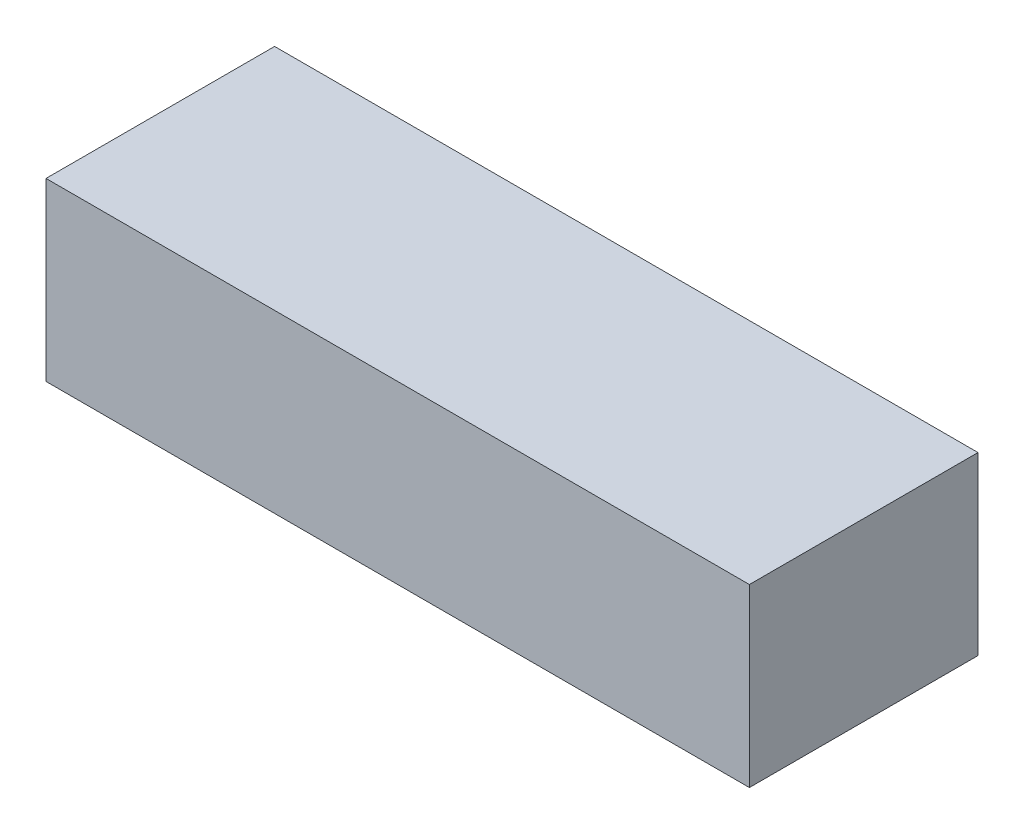
ISO-10303-21;
HEADER;
FILE_DESCRIPTION(('STEP AP214'),'2;1');
FILE_NAME('part.step','',(''),(''),'','','');
FILE_SCHEMA(('AUTOMOTIVE_DESIGN { 1 0 10303 214 1 1 1 1 }'));
ENDSEC;
DATA;
#1=APPLICATION_CONTEXT('core data for automotive mechanical design processes');
#2=APPLICATION_PROTOCOL_DEFINITION('international standard','automotive_design',2000,#1);
#3=PRODUCT_CONTEXT('',#1,'mechanical');
#4=PRODUCT('Part','Part','',(#3));
#5=PRODUCT_RELATED_PRODUCT_CATEGORY('part','',(#4));
#6=PRODUCT_DEFINITION_FORMATION('','',#4);
#7=PRODUCT_DEFINITION_CONTEXT('part definition',#1,'design');
#8=PRODUCT_DEFINITION('design','',#6,#7);
#9=PRODUCT_DEFINITION_SHAPE('','',#8);
#10=(LENGTH_UNIT() NAMED_UNIT(*) SI_UNIT(.MILLI.,.METRE.));
#11=(NAMED_UNIT(*) PLANE_ANGLE_UNIT() SI_UNIT($,.RADIAN.));
#12=(NAMED_UNIT(*) SI_UNIT($,.STERADIAN.) SOLID_ANGLE_UNIT());
#13=UNCERTAINTY_MEASURE_WITH_UNIT(LENGTH_MEASURE(1.E-05),#10,'distance_accuracy_value','');
#14=(GEOMETRIC_REPRESENTATION_CONTEXT(3) GLOBAL_UNCERTAINTY_ASSIGNED_CONTEXT((#13)) GLOBAL_UNIT_ASSIGNED_CONTEXT((#10,
#11,#12)) REPRESENTATION_CONTEXT('',''));
#15=CARTESIAN_POINT('',(0.,0.,0.));
#16=DIRECTION('',(0.,0.,1.));
#17=DIRECTION('',(1.,0.,0.));
#18=AXIS2_PLACEMENT_3D('',#15,#16,#17);
#19=CARTESIAN_POINT('',(0.,10.,0.));
#20=DIRECTION('',(1.,0.,0.));
#21=DIRECTION('',(0.,0.,-1.));
#22=AXIS2_PLACEMENT_3D('',#19,#20,#21);
#23=PLANE('',#22);
#24=DIRECTION('',(0.,0.,1.));
#25=VECTOR('',#24,1.);
#26=CARTESIAN_POINT('',(0.,0.,0.));
#27=LINE('',#26,#25);
#28=CARTESIAN_POINT('',(0.,0.,-13.));
#29=VERTEX_POINT('',#28);
#30=CARTESIAN_POINT('',(0.,0.,0.));
#31=VERTEX_POINT('',#30);
#32=EDGE_CURVE('E106',#29,#31,#27,.T.);
#33=ORIENTED_EDGE('',*,*,#32,.T.);
#34=DIRECTION('',(0.,-1.,0.));
#35=VECTOR('',#34,1.);
#36=CARTESIAN_POINT('',(0.,10.,0.));
#37=LINE('',#36,#35);
#38=CARTESIAN_POINT('',(0.,10.,0.));
#39=VERTEX_POINT('',#38);
#40=EDGE_CURVE('E11',#39,#31,#37,.T.);
#41=ORIENTED_EDGE('',*,*,#40,.F.);
#42=DIRECTION('',(0.,0.,1.));
#43=VECTOR('',#42,1.);
#44=CARTESIAN_POINT('',(0.,10.,0.));
#45=LINE('',#44,#43);
#46=CARTESIAN_POINT('',(0.,10.,-13.));
#47=VERTEX_POINT('',#46);
#48=EDGE_CURVE('E92',#47,#39,#45,.T.);
#49=ORIENTED_EDGE('',*,*,#48,.F.);
#50=DIRECTION('',(0.,-1.,0.));
#51=VECTOR('',#50,1.);
#52=CARTESIAN_POINT('',(0.,10.,-13.));
#53=LINE('',#52,#51);
#54=EDGE_CURVE('E105',#47,#29,#53,.T.);
#55=ORIENTED_EDGE('',*,*,#54,.T.);
#56=EDGE_LOOP('',(#33,#41,#49,#55));
#57=FACE_BOUND('',#56,.T.);
#58=ADVANCED_FACE('F43',(#57),#23,.F.);
#59=CARTESIAN_POINT('',(0.,10.,0.));
#60=DIRECTION('',(0.,0.,-1.));
#61=DIRECTION('',(-1.,0.,0.));
#62=AXIS2_PLACEMENT_3D('',#59,#60,#61);
#63=PLANE('',#62);
#64=DIRECTION('',(1.,0.,0.));
#65=VECTOR('',#64,1.);
#66=CARTESIAN_POINT('',(0.,0.,0.));
#67=LINE('',#66,#65);
#68=CARTESIAN_POINT('',(40.,0.,0.));
#69=VERTEX_POINT('',#68);
#70=EDGE_CURVE('E97',#31,#69,#67,.T.);
#71=ORIENTED_EDGE('',*,*,#70,.T.);
#72=DIRECTION('',(0.,-1.,0.));
#73=VECTOR('',#72,1.);
#74=CARTESIAN_POINT('',(40.,10.,0.));
#75=LINE('',#74,#73);
#76=CARTESIAN_POINT('',(40.,10.,0.));
#77=VERTEX_POINT('',#76);
#78=EDGE_CURVE('E51',#77,#69,#75,.T.);
#79=ORIENTED_EDGE('',*,*,#78,.F.);
#80=DIRECTION('',(1.,0.,0.));
#81=VECTOR('',#80,1.);
#82=CARTESIAN_POINT('',(0.,10.,0.));
#83=LINE('',#82,#81);
#84=EDGE_CURVE('E87',#39,#77,#83,.T.);
#85=ORIENTED_EDGE('',*,*,#84,.F.);
#86=ORIENTED_EDGE('',*,*,#40,.T.);
#87=EDGE_LOOP('',(#71,#79,#85,#86));
#88=FACE_BOUND('',#87,.T.);
#89=ADVANCED_FACE('F100',(#88),#63,.F.);
#90=CARTESIAN_POINT('',(40.,10.,0.));
#91=DIRECTION('',(-1.,0.,0.));
#92=DIRECTION('',(0.,0.,1.));
#93=AXIS2_PLACEMENT_3D('',#90,#91,#92);
#94=PLANE('',#93);
#95=DIRECTION('',(0.,0.,-1.));
#96=VECTOR('',#95,1.);
#97=CARTESIAN_POINT('',(40.,0.,0.));
#98=LINE('',#97,#96);
#99=CARTESIAN_POINT('',(40.,0.,-13.));
#100=VERTEX_POINT('',#99);
#101=EDGE_CURVE('E78',#69,#100,#98,.T.);
#102=ORIENTED_EDGE('',*,*,#101,.T.);
#103=DIRECTION('',(0.,-1.,0.));
#104=VECTOR('',#103,1.);
#105=CARTESIAN_POINT('',(40.,10.,-13.));
#106=LINE('',#105,#104);
#107=CARTESIAN_POINT('',(40.,10.,-13.));
#108=VERTEX_POINT('',#107);
#109=EDGE_CURVE('E98',#108,#100,#106,.T.);
#110=ORIENTED_EDGE('',*,*,#109,.F.);
#111=DIRECTION('',(0.,0.,-1.));
#112=VECTOR('',#111,1.);
#113=CARTESIAN_POINT('',(40.,10.,0.));
#114=LINE('',#113,#112);
#115=EDGE_CURVE('E95',#77,#108,#114,.T.);
#116=ORIENTED_EDGE('',*,*,#115,.F.);
#117=ORIENTED_EDGE('',*,*,#78,.T.);
#118=EDGE_LOOP('',(#102,#110,#116,#117));
#119=FACE_BOUND('',#118,.T.);
#120=ADVANCED_FACE('F99',(#119),#94,.F.);
#121=CARTESIAN_POINT('',(0.,10.,-13.));
#122=DIRECTION('',(0.,0.,1.));
#123=DIRECTION('',(1.,0.,0.));
#124=AXIS2_PLACEMENT_3D('',#121,#122,#123);
#125=PLANE('',#124);
#126=DIRECTION('',(-1.,0.,0.));
#127=VECTOR('',#126,1.);
#128=CARTESIAN_POINT('',(0.,0.,-13.));
#129=LINE('',#128,#127);
#130=EDGE_CURVE('E85',#100,#29,#129,.T.);
#131=ORIENTED_EDGE('',*,*,#130,.T.);
#132=ORIENTED_EDGE('',*,*,#54,.F.);
#133=DIRECTION('',(-1.,0.,0.));
#134=VECTOR('',#133,1.);
#135=CARTESIAN_POINT('',(0.,10.,-13.));
#136=LINE('',#135,#134);
#137=EDGE_CURVE('E56',#108,#47,#136,.T.);
#138=ORIENTED_EDGE('',*,*,#137,.F.);
#139=ORIENTED_EDGE('',*,*,#109,.T.);
#140=EDGE_LOOP('',(#131,#132,#138,#139));
#141=FACE_BOUND('',#140,.T.);
#142=ADVANCED_FACE('F111',(#141),#125,.F.);
#143=CARTESIAN_POINT('',(0.,10.,0.));
#144=DIRECTION('',(0.,-1.,0.));
#145=DIRECTION('',(0.,0.,-1.));
#146=AXIS2_PLACEMENT_3D('',#143,#144,#145);
#147=PLANE('',#146);
#148=ORIENTED_EDGE('',*,*,#48,.T.);
#149=ORIENTED_EDGE('',*,*,#84,.T.);
#150=ORIENTED_EDGE('',*,*,#115,.T.);
#151=ORIENTED_EDGE('',*,*,#137,.T.);
#152=EDGE_LOOP('',(#148,#149,#150,#151));
#153=FACE_BOUND('',#152,.T.);
#154=ADVANCED_FACE('F89',(#153),#147,.F.);
#155=CARTESIAN_POINT('',(0.,0.,0.));
#156=DIRECTION('',(0.,-1.,0.));
#157=DIRECTION('',(0.,0.,-1.));
#158=AXIS2_PLACEMENT_3D('',#155,#156,#157);
#159=PLANE('',#158);
#160=ORIENTED_EDGE('',*,*,#32,.F.);
#161=ORIENTED_EDGE('',*,*,#130,.F.);
#162=ORIENTED_EDGE('',*,*,#101,.F.);
#163=ORIENTED_EDGE('',*,*,#70,.F.);
#164=EDGE_LOOP('',(#160,#161,#162,#163));
#165=FACE_BOUND('',#164,.T.);
#166=ADVANCED_FACE('F116',(#165),#159,.T.);
#167=CLOSED_SHELL('',(#58,#89,#120,#142,#154,#166));
#168=MANIFOLD_SOLID_BREP('B2',#167);
#169=ADVANCED_BREP_SHAPE_REPRESENTATION('',(#18,#168),#14);
#170=SHAPE_DEFINITION_REPRESENTATION(#9,#169);
ENDSEC;
END-ISO-10303-21;
